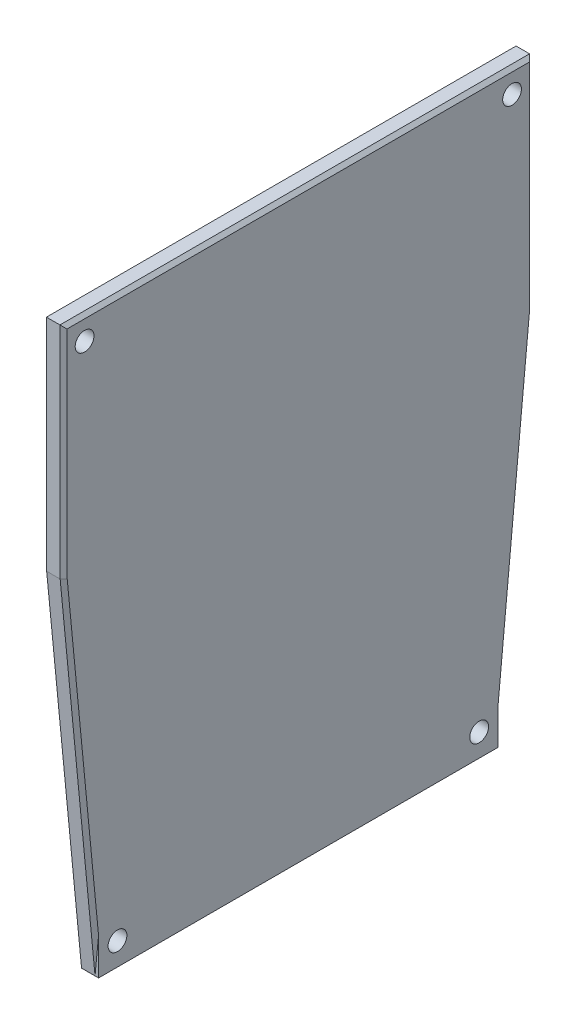
ISO-10303-21;
HEADER;
FILE_DESCRIPTION(('STEP AP214'),'2;1');
FILE_NAME('part.step','',(''),(''),'','','');
FILE_SCHEMA(('AUTOMOTIVE_DESIGN { 1 0 10303 214 1 1 1 1 }'));
ENDSEC;
DATA;
#1=APPLICATION_CONTEXT('core data for automotive mechanical design processes');
#2=APPLICATION_PROTOCOL_DEFINITION('international standard','automotive_design',2000,#1);
#3=PRODUCT_CONTEXT('',#1,'mechanical');
#4=PRODUCT('Part','Part','',(#3));
#5=PRODUCT_RELATED_PRODUCT_CATEGORY('part','',(#4));
#6=PRODUCT_DEFINITION_FORMATION('','',#4);
#7=PRODUCT_DEFINITION_CONTEXT('part definition',#1,'design');
#8=PRODUCT_DEFINITION('design','',#6,#7);
#9=PRODUCT_DEFINITION_SHAPE('','',#8);
#10=(LENGTH_UNIT() NAMED_UNIT(*) SI_UNIT(.MILLI.,.METRE.));
#11=(NAMED_UNIT(*) PLANE_ANGLE_UNIT() SI_UNIT($,.RADIAN.));
#12=(NAMED_UNIT(*) SI_UNIT($,.STERADIAN.) SOLID_ANGLE_UNIT());
#13=UNCERTAINTY_MEASURE_WITH_UNIT(LENGTH_MEASURE(1.E-05),#10,'distance_accuracy_value','');
#14=(GEOMETRIC_REPRESENTATION_CONTEXT(3) GLOBAL_UNCERTAINTY_ASSIGNED_CONTEXT((#13)) GLOBAL_UNIT_ASSIGNED_CONTEXT((#10,
#11,#12)) REPRESENTATION_CONTEXT('',''));
#15=CARTESIAN_POINT('',(0.,0.,0.));
#16=DIRECTION('',(0.,0.,1.));
#17=DIRECTION('',(1.,0.,0.));
#18=AXIS2_PLACEMENT_3D('',#15,#16,#17);
#19=CARTESIAN_POINT('',(31.6,-12.9798337295823,0.));
#20=DIRECTION('',(0.,-1.,0.));
#21=DIRECTION('',(0.,0.,-1.));
#22=AXIS2_PLACEMENT_3D('',#19,#20,#21);
#23=PLANE('',#22);
#24=DIRECTION('',(1.,0.,0.));
#25=VECTOR('',#24,1.);
#26=CARTESIAN_POINT('',(31.6,-12.9798337295823,42.209268938857));
#27=LINE('',#26,#25);
#28=CARTESIAN_POINT('',(30.15,-12.9798337295823,42.2092689388571));
#29=VERTEX_POINT('',#28);
#30=CARTESIAN_POINT('',(31.3,-12.9798337295823,42.209268938857));
#31=VERTEX_POINT('',#30);
#32=EDGE_CURVE('E175',#29,#31,#27,.T.);
#33=ORIENTED_EDGE('',*,*,#32,.T.);
#34=DIRECTION('',(0.,0.,-1.));
#35=VECTOR('',#34,1.);
#36=CARTESIAN_POINT('',(31.3,-12.9798337295823,2.5));
#37=LINE('',#36,#35);
#38=CARTESIAN_POINT('',(31.3,-12.9798337295823,2.2));
#39=VERTEX_POINT('',#38);
#40=EDGE_CURVE('E50',#31,#39,#37,.T.);
#41=ORIENTED_EDGE('',*,*,#40,.T.);
#42=DIRECTION('',(1.,0.,0.));
#43=VECTOR('',#42,1.);
#44=CARTESIAN_POINT('',(21.6,-12.9798337295823,2.2));
#45=LINE('',#44,#43);
#46=CARTESIAN_POINT('',(30.15,-12.9798337295823,2.2));
#47=VERTEX_POINT('',#46);
#48=EDGE_CURVE('E246',#47,#39,#45,.T.);
#49=ORIENTED_EDGE('',*,*,#48,.F.);
#50=DIRECTION('',(0.,0.,1.));
#51=VECTOR('',#50,1.);
#52=CARTESIAN_POINT('',(30.15,-12.9798337295823,0.));
#53=LINE('',#52,#51);
#54=EDGE_CURVE('E184',#47,#29,#53,.T.);
#55=ORIENTED_EDGE('',*,*,#54,.T.);
#56=EDGE_LOOP('',(#33,#41,#49,#55));
#57=FACE_BOUND('',#56,.T.);
#58=ADVANCED_FACE('F41',(#57),#23,.F.);
#59=CARTESIAN_POINT('',(31.6,-62.5097700608601,0.));
#60=DIRECTION('',(0.,1.,0.));
#61=DIRECTION('',(0.,0.,1.));
#62=AXIS2_PLACEMENT_3D('',#59,#60,#61);
#63=PLANE('',#62);
#64=DIRECTION('',(0.,0.,-1.));
#65=VECTOR('',#64,1.);
#66=CARTESIAN_POINT('',(31.6,-62.5097700608601,0.));
#67=LINE('',#66,#65);
#68=CARTESIAN_POINT('',(31.6,-62.5097700608601,39.2193923236684));
#69=VERTEX_POINT('',#68);
#70=CARTESIAN_POINT('',(31.6,-62.5097700608601,5.18060767633156));
#71=VERTEX_POINT('',#70);
#72=EDGE_CURVE('E151',#69,#71,#67,.T.);
#73=ORIENTED_EDGE('',*,*,#72,.F.);
#74=DIRECTION('',(1.,0.,0.));
#75=VECTOR('',#74,1.);
#76=CARTESIAN_POINT('',(21.6,-62.5097700608601,39.2193923236684));
#77=LINE('',#76,#75);
#78=CARTESIAN_POINT('',(30.15,-62.5097700608601,39.2193923236684));
#79=VERTEX_POINT('',#78);
#80=EDGE_CURVE('E134',#79,#69,#77,.T.);
#81=ORIENTED_EDGE('',*,*,#80,.F.);
#82=DIRECTION('',(0.,0.,-1.));
#83=VECTOR('',#82,1.);
#84=CARTESIAN_POINT('',(30.15,-62.5097700608601,0.));
#85=LINE('',#84,#83);
#86=CARTESIAN_POINT('',(30.15,-62.5097700608601,5.18060767633156));
#87=VERTEX_POINT('',#86);
#88=EDGE_CURVE('E187',#79,#87,#85,.T.);
#89=ORIENTED_EDGE('',*,*,#88,.T.);
#90=DIRECTION('',(1.,0.,0.));
#91=VECTOR('',#90,1.);
#92=CARTESIAN_POINT('',(31.6,-62.5097700608601,5.18060767633156));
#93=LINE('',#92,#91);
#94=EDGE_CURVE('E159',#87,#71,#93,.T.);
#95=ORIENTED_EDGE('',*,*,#94,.T.);
#96=EDGE_LOOP('',(#73,#81,#89,#95));
#97=FACE_BOUND('',#96,.T.);
#98=ADVANCED_FACE('F158',(#97),#63,.F.);
#99=CARTESIAN_POINT('',(31.6,-14.9298337295823,40.4092690105694));
#100=DIRECTION('',(-1.,0.,0.));
#101=DIRECTION('',(0.,0.,1.));
#102=AXIS2_PLACEMENT_3D('',#99,#100,#101);
#103=CYLINDRICAL_SURFACE('',#102,0.800000000000002);
#104=CARTESIAN_POINT('',(31.6,-14.9298337295823,40.4092690105694));
#105=DIRECTION('',(1.,0.,0.));
#106=DIRECTION('',(0.,0.,-1.));
#107=AXIS2_PLACEMENT_3D('',#104,#105,#106);
#108=CIRCLE('',#107,0.800000000000002);
#109=CARTESIAN_POINT('',(31.6,-14.9298337295823,39.6092690105694));
#110=VERTEX_POINT('',#109);
#111=EDGE_CURVE('E161',#110,#110,#108,.T.);
#112=ORIENTED_EDGE('',*,*,#111,.T.);
#113=EDGE_LOOP('',(#112));
#114=FACE_BOUND('',#113,.T.);
#115=CARTESIAN_POINT('',(30.15,-14.9298337295823,40.4092690105694));
#116=DIRECTION('',(1.,0.,0.));
#117=DIRECTION('',(0.,0.,-1.));
#118=AXIS2_PLACEMENT_3D('',#115,#116,#117);
#119=CIRCLE('',#118,0.800000000000002);
#120=CARTESIAN_POINT('',(30.15,-14.9298337295823,39.6092690105694));
#121=VERTEX_POINT('',#120);
#122=EDGE_CURVE('E181',#121,#121,#119,.T.);
#123=ORIENTED_EDGE('',*,*,#122,.F.);
#124=EDGE_LOOP('',(#123));
#125=FACE_BOUND('',#124,.T.);
#126=ADVANCED_FACE('F300',(#114,#125),#103,.F.);
#127=CARTESIAN_POINT('',(31.6,-14.9298337295823,3.9907309894306));
#128=DIRECTION('',(-1.,0.,0.));
#129=DIRECTION('',(0.,0.,1.));
#130=AXIS2_PLACEMENT_3D('',#127,#128,#129);
#131=CYLINDRICAL_SURFACE('',#130,0.8);
#132=CARTESIAN_POINT('',(31.6,-14.9298337295823,3.9907309894306));
#133=DIRECTION('',(1.,0.,0.));
#134=DIRECTION('',(0.,0.,-1.));
#135=AXIS2_PLACEMENT_3D('',#132,#133,#134);
#136=CIRCLE('',#135,0.8);
#137=CARTESIAN_POINT('',(31.6,-14.9298337295823,3.1907309894306));
#138=VERTEX_POINT('',#137);
#139=EDGE_CURVE('E167',#138,#138,#136,.T.);
#140=ORIENTED_EDGE('',*,*,#139,.T.);
#141=EDGE_LOOP('',(#140));
#142=FACE_BOUND('',#141,.T.);
#143=CARTESIAN_POINT('',(30.15,-14.9298337295823,3.9907309894306));
#144=DIRECTION('',(1.,0.,0.));
#145=DIRECTION('',(0.,0.,-1.));
#146=AXIS2_PLACEMENT_3D('',#143,#144,#145);
#147=CIRCLE('',#146,0.8);
#148=CARTESIAN_POINT('',(30.15,-14.9298337295823,3.1907309894306));
#149=VERTEX_POINT('',#148);
#150=EDGE_CURVE('E178',#149,#149,#147,.T.);
#151=ORIENTED_EDGE('',*,*,#150,.F.);
#152=EDGE_LOOP('',(#151));
#153=FACE_BOUND('',#152,.T.);
#154=ADVANCED_FACE('F290',(#142,#153),#131,.F.);
#155=CARTESIAN_POINT('',(31.6,-60.5690390714295,6.79357246262316));
#156=DIRECTION('',(-1.,0.,0.));
#157=DIRECTION('',(0.,0.,1.));
#158=AXIS2_PLACEMENT_3D('',#155,#156,#157);
#159=CYLINDRICAL_SURFACE('',#158,0.800000000000002);
#160=CARTESIAN_POINT('',(31.6,-60.5690390714295,6.79357246262316));
#161=DIRECTION('',(1.,0.,0.));
#162=DIRECTION('',(0.,0.,-1.));
#163=AXIS2_PLACEMENT_3D('',#160,#161,#162);
#164=CIRCLE('',#163,0.800000000000002);
#165=CARTESIAN_POINT('',(31.6,-60.5690390714295,5.99357246262315));
#166=VERTEX_POINT('',#165);
#167=EDGE_CURVE('E285',#166,#166,#164,.T.);
#168=ORIENTED_EDGE('',*,*,#167,.T.);
#169=EDGE_LOOP('',(#168));
#170=FACE_BOUND('',#169,.T.);
#171=CARTESIAN_POINT('',(30.15,-60.5690390714295,6.79357246262316));
#172=DIRECTION('',(1.,0.,0.));
#173=DIRECTION('',(0.,0.,-1.));
#174=AXIS2_PLACEMENT_3D('',#171,#172,#173);
#175=CIRCLE('',#174,0.800000000000002);
#176=CARTESIAN_POINT('',(30.15,-60.5690390714295,5.99357246262315));
#177=VERTEX_POINT('',#176);
#178=EDGE_CURVE('E174',#177,#177,#175,.T.);
#179=ORIENTED_EDGE('',*,*,#178,.F.);
#180=EDGE_LOOP('',(#179));
#181=FACE_BOUND('',#180,.T.);
#182=ADVANCED_FACE('F348',(#170,#181),#159,.F.);
#183=CARTESIAN_POINT('',(31.6,-60.5690390714295,37.6064275373769));
#184=DIRECTION('',(-1.,0.,0.));
#185=DIRECTION('',(0.,0.,1.));
#186=AXIS2_PLACEMENT_3D('',#183,#184,#185);
#187=CYLINDRICAL_SURFACE('',#186,0.800000000000003);
#188=CARTESIAN_POINT('',(31.6,-60.5690390714295,37.6064275373769));
#189=DIRECTION('',(1.,0.,0.));
#190=DIRECTION('',(0.,0.,-1.));
#191=AXIS2_PLACEMENT_3D('',#188,#189,#190);
#192=CIRCLE('',#191,0.800000000000003);
#193=CARTESIAN_POINT('',(31.6,-60.5690390714295,36.8064275373768));
#194=VERTEX_POINT('',#193);
#195=EDGE_CURVE('E188',#194,#194,#192,.T.);
#196=ORIENTED_EDGE('',*,*,#195,.T.);
#197=EDGE_LOOP('',(#196));
#198=FACE_BOUND('',#197,.T.);
#199=CARTESIAN_POINT('',(30.15,-60.5690390714295,37.6064275373769));
#200=DIRECTION('',(1.,0.,0.));
#201=DIRECTION('',(0.,0.,-1.));
#202=AXIS2_PLACEMENT_3D('',#199,#200,#201);
#203=CIRCLE('',#202,0.800000000000003);
#204=CARTESIAN_POINT('',(30.15,-60.5690390714295,36.8064275373768));
#205=VERTEX_POINT('',#204);
#206=EDGE_CURVE('E171',#205,#205,#203,.T.);
#207=ORIENTED_EDGE('',*,*,#206,.F.);
#208=EDGE_LOOP('',(#207));
#209=FACE_BOUND('',#208,.T.);
#210=ADVANCED_FACE('F296',(#198,#209),#187,.F.);
#211=CARTESIAN_POINT('',(31.6,0.,0.));
#212=DIRECTION('',(1.,0.,0.));
#213=DIRECTION('',(0.,0.,-1.));
#214=AXIS2_PLACEMENT_3D('',#211,#212,#213);
#215=PLANE('',#214);
#216=DIRECTION('',(0.,1.,0.));
#217=VECTOR('',#216,1.);
#218=CARTESIAN_POINT('',(31.6,-12.9798337295823,2.5));
#219=LINE('',#218,#217);
#220=CARTESIAN_POINT('',(31.6,-31.0470612247422,2.5));
#221=VERTEX_POINT('',#220);
#222=CARTESIAN_POINT('',(31.6,-13.2798337295823,2.5));
#223=VERTEX_POINT('',#222);
#224=EDGE_CURVE('E212',#221,#223,#219,.T.);
#225=ORIENTED_EDGE('',*,*,#224,.T.);
#226=DIRECTION('',(0.,0.,1.));
#227=VECTOR('',#226,1.);
#228=CARTESIAN_POINT('',(31.6,-13.2798337295823,41.9092687954324));
#229=LINE('',#228,#227);
#230=CARTESIAN_POINT('',(31.6,-13.2798337295823,41.9089754444646));
#231=VERTEX_POINT('',#230);
#232=EDGE_CURVE('E238',#223,#231,#229,.T.);
#233=ORIENTED_EDGE('',*,*,#232,.T.);
#234=DIRECTION('',(0.,-0.999999521918175,-0.000977836091834958));
#235=VECTOR('',#234,1.);
#236=CARTESIAN_POINT('',(31.6,-31.7375962208836,41.8909267694974));
#237=LINE('',#236,#235);
#238=CARTESIAN_POINT('',(31.6,-31.7232851239901,41.8909407634111));
#239=VERTEX_POINT('',#238);
#240=EDGE_CURVE('E232',#231,#239,#237,.T.);
#241=ORIENTED_EDGE('',*,*,#240,.T.);
#242=DIRECTION('',(0.,-0.995365494715316,-0.0961640885681093));
#243=VECTOR('',#242,1.);
#244=CARTESIAN_POINT('',(31.6,-62.4664962210045,38.9207826752538));
#245=LINE('',#244,#243);
#246=CARTESIAN_POINT('',(31.6,-59.3756777580347,39.2193923236684));
#247=VERTEX_POINT('',#246);
#248=EDGE_CURVE('E153',#239,#247,#245,.T.);
#249=ORIENTED_EDGE('',*,*,#248,.T.);
#250=DIRECTION('',(0.,1.,0.));
#251=VECTOR('',#250,1.);
#252=CARTESIAN_POINT('',(31.6,-62.5097700608601,39.2193923236684));
#253=LINE('',#252,#251);
#254=EDGE_CURVE('E137',#69,#247,#253,.T.);
#255=ORIENTED_EDGE('',*,*,#254,.F.);
#256=ORIENTED_EDGE('',*,*,#72,.T.);
#257=DIRECTION('',(0.,-1.,0.));
#258=VECTOR('',#257,1.);
#259=CARTESIAN_POINT('',(31.6,-62.4953454475749,5.18060767633156));
#260=LINE('',#259,#258);
#261=CARTESIAN_POINT('',(31.6,-59.3756777580348,5.18060767633156));
#262=VERTEX_POINT('',#261);
#263=EDGE_CURVE('E228',#262,#71,#260,.T.);
#264=ORIENTED_EDGE('',*,*,#263,.F.);
#265=DIRECTION('',(0.,0.995365494715316,-0.0961640885681094));
#266=VECTOR('',#265,1.);
#267=CARTESIAN_POINT('',(31.6,-31.7081365017841,2.50759570037504));
#268=LINE('',#267,#266);
#269=CARTESIAN_POINT('',(31.6,-31.7205735939202,2.50879727068873));
#270=VERTEX_POINT('',#269);
#271=EDGE_CURVE('E208',#262,#270,#268,.T.);
#272=ORIENTED_EDGE('',*,*,#271,.T.);
#273=DIRECTION('',(0.,0.999914705859767,-0.0130606663450287));
#274=VECTOR('',#273,1.);
#275=CARTESIAN_POINT('',(31.6,-31.0451022083439,2.49997441175793));
#276=LINE('',#275,#274);
#277=EDGE_CURVE('E210',#270,#221,#276,.T.);
#278=ORIENTED_EDGE('',*,*,#277,.T.);
#279=EDGE_LOOP('',(#225,#233,#241,#249,#255,#256,#264,#272,#278));
#280=FACE_BOUND('',#279,.T.);
#281=ORIENTED_EDGE('',*,*,#195,.F.);
#282=EDGE_LOOP('',(#281));
#283=FACE_BOUND('',#282,.T.);
#284=ORIENTED_EDGE('',*,*,#167,.F.);
#285=EDGE_LOOP('',(#284));
#286=FACE_BOUND('',#285,.T.);
#287=ORIENTED_EDGE('',*,*,#139,.F.);
#288=EDGE_LOOP('',(#287));
#289=FACE_BOUND('',#288,.T.);
#290=ORIENTED_EDGE('',*,*,#111,.F.);
#291=EDGE_LOOP('',(#290));
#292=FACE_BOUND('',#291,.T.);
#293=ADVANCED_FACE('F149',(#280,#283,#286,#289,#292),#215,.T.);
#294=CARTESIAN_POINT('',(30.15,0.,0.));
#295=DIRECTION('',(1.,0.,0.));
#296=DIRECTION('',(0.,0.,-1.));
#297=AXIS2_PLACEMENT_3D('',#294,#295,#296);
#298=PLANE('',#297);
#299=ORIENTED_EDGE('',*,*,#206,.T.);
#300=EDGE_LOOP('',(#299));
#301=FACE_BOUND('',#300,.T.);
#302=ORIENTED_EDGE('',*,*,#178,.T.);
#303=EDGE_LOOP('',(#302));
#304=FACE_BOUND('',#303,.T.);
#305=ORIENTED_EDGE('',*,*,#150,.T.);
#306=EDGE_LOOP('',(#305));
#307=FACE_BOUND('',#306,.T.);
#308=ORIENTED_EDGE('',*,*,#122,.T.);
#309=EDGE_LOOP('',(#308));
#310=FACE_BOUND('',#309,.T.);
#311=DIRECTION('',(0.,0.995365494715316,0.0961640885681093));
#312=VECTOR('',#311,1.);
#313=CARTESIAN_POINT('',(30.15,-4.33194579619204,44.8386651889566));
#314=LINE('',#313,#312);
#315=CARTESIAN_POINT('',(30.15,-62.4953454475749,39.2193923236684));
#316=VERTEX_POINT('',#315);
#317=CARTESIAN_POINT('',(30.15,-31.7378895717112,42.1909266260728));
#318=VERTEX_POINT('',#317);
#319=EDGE_CURVE('E199',#316,#318,#314,.T.);
#320=ORIENTED_EDGE('',*,*,#319,.T.);
#321=DIRECTION('',(0.,0.999999521918175,0.000977836091834958));
#322=VECTOR('',#321,1.);
#323=CARTESIAN_POINT('',(30.15,-0.0412861376883969,42.2219207237169));
#324=LINE('',#323,#322);
#325=EDGE_CURVE('E202',#318,#29,#324,.T.);
#326=ORIENTED_EDGE('',*,*,#325,.T.);
#327=ORIENTED_EDGE('',*,*,#54,.F.);
#328=DIRECTION('',(0.,-1.,0.));
#329=VECTOR('',#328,1.);
#330=CARTESIAN_POINT('',(30.15,0.,2.2));
#331=LINE('',#330,#329);
#332=CARTESIAN_POINT('',(30.15,-31.0490204082474,2.2));
#333=VERTEX_POINT('',#332);
#334=EDGE_CURVE('E160',#47,#333,#331,.T.);
#335=ORIENTED_EDGE('',*,*,#334,.T.);
#336=DIRECTION('',(0.,-0.999914705859767,0.0130606663450287));
#337=VECTOR('',#336,1.);
#338=CARTESIAN_POINT('',(30.15,0.0234346420456044,1.79413841445223));
#339=LINE('',#338,#337);
#340=CARTESIAN_POINT('',(30.15,-31.7369857283545,2.20898605196045));
#341=VERTEX_POINT('',#340);
#342=EDGE_CURVE('E164',#333,#341,#339,.T.);
#343=ORIENTED_EDGE('',*,*,#342,.T.);
#344=DIRECTION('',(0.,-0.995365494715316,0.0961640885681094));
#345=VECTOR('',#344,1.);
#346=CARTESIAN_POINT('',(30.15,-0.0820481439319504,-0.849255606654629));
#347=LINE('',#346,#345);
#348=CARTESIAN_POINT('',(30.15,-62.4953454475749,5.18060767633156));
#349=VERTEX_POINT('',#348);
#350=EDGE_CURVE('E192',#341,#349,#347,.T.);
#351=ORIENTED_EDGE('',*,*,#350,.T.);
#352=DIRECTION('',(0.,-1.,0.));
#353=VECTOR('',#352,1.);
#354=CARTESIAN_POINT('',(30.15,0.,5.18060767633156));
#355=LINE('',#354,#353);
#356=EDGE_CURVE('E195',#349,#87,#355,.T.);
#357=ORIENTED_EDGE('',*,*,#356,.T.);
#358=ORIENTED_EDGE('',*,*,#88,.F.);
#359=DIRECTION('',(0.,1.,0.));
#360=VECTOR('',#359,1.);
#361=CARTESIAN_POINT('',(30.15,0.,39.2193923236684));
#362=LINE('',#361,#360);
#363=EDGE_CURVE('E140',#79,#316,#362,.T.);
#364=ORIENTED_EDGE('',*,*,#363,.T.);
#365=EDGE_LOOP('',(#320,#326,#327,#335,#343,#351,#357,#358,#364));
#366=FACE_BOUND('',#365,.T.);
#367=ADVANCED_FACE('F295',(#301,#304,#307,#310,#366),#298,.F.);
#368=CARTESIAN_POINT('',(21.6,-62.4953454475749,5.18060767633156));
#369=DIRECTION('',(0.,0.,1.));
#370=DIRECTION('',(1.,0.,0.));
#371=AXIS2_PLACEMENT_3D('',#368,#369,#370);
#372=PLANE('',#371);
#373=ORIENTED_EDGE('',*,*,#356,.F.);
#374=DIRECTION('',(1.,0.,0.));
#375=VECTOR('',#374,1.);
#376=CARTESIAN_POINT('',(21.6,-62.4953454475749,5.18060767633156));
#377=LINE('',#376,#375);
#378=CARTESIAN_POINT('',(31.3,-62.4953454475749,5.18060767633156));
#379=VERTEX_POINT('',#378);
#380=EDGE_CURVE('E155',#349,#379,#377,.T.);
#381=ORIENTED_EDGE('',*,*,#380,.T.);
#382=DIRECTION('',(0.0957225086225032,0.995408057704485,0.));
#383=VECTOR('',#382,1.);
#384=CARTESIAN_POINT('',(31.2111208530272,-63.4195901245242,5.18060767633156));
#385=LINE('',#384,#383);
#386=EDGE_CURVE('E218',#379,#262,#385,.T.);
#387=ORIENTED_EDGE('',*,*,#386,.T.);
#388=ORIENTED_EDGE('',*,*,#263,.T.);
#389=ORIENTED_EDGE('',*,*,#94,.F.);
#390=EDGE_LOOP('',(#373,#381,#387,#388,#389));
#391=FACE_BOUND('',#390,.T.);
#392=ADVANCED_FACE('F308',(#391),#372,.F.);
#393=CARTESIAN_POINT('',(21.6,-31.7369857283545,2.20898605196045));
#394=DIRECTION('',(0.,0.0961640885681094,0.995365494715316));
#395=DIRECTION('',(0.,-0.995365494715316,0.0961640885681094));
#396=AXIS2_PLACEMENT_3D('',#393,#394,#395);
#397=PLANE('',#396);
#398=DIRECTION('',(1.,0.,0.));
#399=VECTOR('',#398,1.);
#400=CARTESIAN_POINT('',(21.6,-31.7369857283545,2.20898605196045));
#401=LINE('',#400,#399);
#402=CARTESIAN_POINT('',(31.3,-31.7369857283545,2.20898605196045));
#403=VERTEX_POINT('',#402);
#404=EDGE_CURVE('E277',#341,#403,#401,.T.);
#405=ORIENTED_EDGE('',*,*,#404,.T.);
#406=DIRECTION('',(0.,-0.995365494715316,0.0961640885681094));
#407=VECTOR('',#406,1.);
#408=CARTESIAN_POINT('',(31.3,-62.4953454475749,5.18060767633156));
#409=LINE('',#408,#407);
#410=EDGE_CURVE('E216',#403,#379,#409,.T.);
#411=ORIENTED_EDGE('',*,*,#410,.T.);
#412=ORIENTED_EDGE('',*,*,#380,.F.);
#413=ORIENTED_EDGE('',*,*,#350,.F.);
#414=EDGE_LOOP('',(#405,#411,#412,#413));
#415=FACE_BOUND('',#414,.T.);
#416=ADVANCED_FACE('F315',(#415),#397,.F.);
#417=CARTESIAN_POINT('',(21.6,-31.0490204082474,2.2));
#418=DIRECTION('',(0.,0.0130606663450287,0.999914705859767));
#419=DIRECTION('',(0.,-0.999914705859767,0.0130606663450287));
#420=AXIS2_PLACEMENT_3D('',#417,#418,#419);
#421=PLANE('',#420);
#422=DIRECTION('',(1.,0.,0.));
#423=VECTOR('',#422,1.);
#424=CARTESIAN_POINT('',(21.6,-31.0490204082474,2.2));
#425=LINE('',#424,#423);
#426=CARTESIAN_POINT('',(31.3,-31.0490204082474,2.2));
#427=VERTEX_POINT('',#426);
#428=EDGE_CURVE('E251',#333,#427,#425,.T.);
#429=ORIENTED_EDGE('',*,*,#428,.T.);
#430=DIRECTION('',(0.,-0.999914705859767,0.0130606663450287));
#431=VECTOR('',#430,1.);
#432=CARTESIAN_POINT('',(31.3,-31.7369857283545,2.20898605196045));
#433=LINE('',#432,#431);
#434=EDGE_CURVE('E214',#427,#403,#433,.T.);
#435=ORIENTED_EDGE('',*,*,#434,.T.);
#436=ORIENTED_EDGE('',*,*,#404,.F.);
#437=ORIENTED_EDGE('',*,*,#342,.F.);
#438=EDGE_LOOP('',(#429,#435,#436,#437));
#439=FACE_BOUND('',#438,.T.);
#440=ADVANCED_FACE('F326',(#439),#421,.F.);
#441=CARTESIAN_POINT('',(21.6,-31.0490204082474,2.2));
#442=DIRECTION('',(0.,0.,1.));
#443=DIRECTION('',(1.,0.,0.));
#444=AXIS2_PLACEMENT_3D('',#441,#442,#443);
#445=PLANE('',#444);
#446=ORIENTED_EDGE('',*,*,#48,.T.);
#447=DIRECTION('',(0.,-1.,0.));
#448=VECTOR('',#447,1.);
#449=CARTESIAN_POINT('',(31.3,-31.0490204082474,2.2));
#450=LINE('',#449,#448);
#451=EDGE_CURVE('E205',#39,#427,#450,.T.);
#452=ORIENTED_EDGE('',*,*,#451,.T.);
#453=ORIENTED_EDGE('',*,*,#428,.F.);
#454=ORIENTED_EDGE('',*,*,#334,.F.);
#455=EDGE_LOOP('',(#446,#452,#453,#454));
#456=FACE_BOUND('',#455,.T.);
#457=ADVANCED_FACE('F249',(#456),#445,.F.);
#458=CARTESIAN_POINT('',(21.6,-12.9796870541685,42.2092690822816));
#459=DIRECTION('',(0.,0.000977836091834958,-0.999999521918175));
#460=DIRECTION('',(0.,0.999999521918175,0.000977836091834958));
#461=AXIS2_PLACEMENT_3D('',#458,#459,#460);
#462=PLANE('',#461);
#463=DIRECTION('',(1.,0.,0.));
#464=VECTOR('',#463,1.);
#465=CARTESIAN_POINT('',(21.6,-31.7378895717112,42.1909266260728));
#466=LINE('',#465,#464);
#467=CARTESIAN_POINT('',(31.3,-31.7378895717112,42.1909266260728));
#468=VERTEX_POINT('',#467);
#469=EDGE_CURVE('E270',#318,#468,#466,.T.);
#470=ORIENTED_EDGE('',*,*,#469,.T.);
#471=DIRECTION('',(0.,0.999999521918175,0.000977836091834958));
#472=VECTOR('',#471,1.);
#473=CARTESIAN_POINT('',(31.3,-12.9798337295823,42.2092689388571));
#474=LINE('',#473,#472);
#475=EDGE_CURVE('E221',#468,#31,#474,.T.);
#476=ORIENTED_EDGE('',*,*,#475,.T.);
#477=ORIENTED_EDGE('',*,*,#32,.F.);
#478=ORIENTED_EDGE('',*,*,#325,.F.);
#479=EDGE_LOOP('',(#470,#476,#477,#478));
#480=FACE_BOUND('',#479,.T.);
#481=ADVANCED_FACE('F335',(#480),#462,.F.);
#482=CARTESIAN_POINT('',(21.6,-31.7378895717112,42.1909266260728));
#483=DIRECTION('',(0.,0.0961640885681093,-0.995365494715316));
#484=DIRECTION('',(0.,0.995365494715316,0.0961640885681093));
#485=AXIS2_PLACEMENT_3D('',#482,#483,#484);
#486=PLANE('',#485);
#487=DIRECTION('',(1.,0.,0.));
#488=VECTOR('',#487,1.);
#489=CARTESIAN_POINT('',(21.6,-62.4953454475749,39.2193923236684));
#490=LINE('',#489,#488);
#491=CARTESIAN_POINT('',(31.3,-62.4953454475749,39.2193923236684));
#492=VERTEX_POINT('',#491);
#493=EDGE_CURVE('E145',#316,#492,#490,.T.);
#494=ORIENTED_EDGE('',*,*,#493,.T.);
#495=DIRECTION('',(0.,0.995365494715316,0.0961640885681093));
#496=VECTOR('',#495,1.);
#497=CARTESIAN_POINT('',(31.3,-31.7378895717111,42.1909266260728));
#498=LINE('',#497,#496);
#499=EDGE_CURVE('E234',#492,#468,#498,.T.);
#500=ORIENTED_EDGE('',*,*,#499,.T.);
#501=ORIENTED_EDGE('',*,*,#469,.F.);
#502=ORIENTED_EDGE('',*,*,#319,.F.);
#503=EDGE_LOOP('',(#494,#500,#501,#502));
#504=FACE_BOUND('',#503,.T.);
#505=ADVANCED_FACE('F267',(#504),#486,.F.);
#506=CARTESIAN_POINT('',(21.6,-62.5097700608601,39.2193923236684));
#507=DIRECTION('',(0.,0.,-1.));
#508=DIRECTION('',(-1.,0.,0.));
#509=AXIS2_PLACEMENT_3D('',#506,#507,#508);
#510=PLANE('',#509);
#511=ORIENTED_EDGE('',*,*,#80,.T.);
#512=ORIENTED_EDGE('',*,*,#254,.T.);
#513=DIRECTION('',(-0.0957225086225032,-0.995408057704485,0.));
#514=VECTOR('',#513,1.);
#515=CARTESIAN_POINT('',(31.2097464332287,-63.4338825679822,39.2193923236684));
#516=LINE('',#515,#514);
#517=EDGE_CURVE('E236',#247,#492,#516,.T.);
#518=ORIENTED_EDGE('',*,*,#517,.T.);
#519=ORIENTED_EDGE('',*,*,#493,.F.);
#520=ORIENTED_EDGE('',*,*,#363,.F.);
#521=EDGE_LOOP('',(#511,#512,#518,#519,#520));
#522=FACE_BOUND('',#521,.T.);
#523=ADVANCED_FACE('F136',(#522),#510,.F.);
#524=CARTESIAN_POINT('',(31.3,-31.7369857283545,2.20898605196045));
#525=DIRECTION('',(0.70710678118655,-0.0679982791331337,-0.7038296910723));
#526=DIRECTION('',(0.,0.995365494715316,-0.0961640885681094));
#527=AXIS2_PLACEMENT_3D('',#524,#525,#526);
#528=PLANE('',#527);
#529=ORIENTED_EDGE('',*,*,#386,.F.);
#530=ORIENTED_EDGE('',*,*,#410,.F.);
#531=DIRECTION('',(0.706800322005664,0.0386670063430628,0.706355553126862));
#532=VECTOR('',#531,1.);
#533=CARTESIAN_POINT('',(31.3,-31.7369857283545,2.20898605196045));
#534=LINE('',#533,#532);
#535=EDGE_CURVE('E224',#270,#403,#534,.F.);
#536=ORIENTED_EDGE('',*,*,#535,.F.);
#537=ORIENTED_EDGE('',*,*,#271,.F.);
#538=EDGE_LOOP('',(#529,#530,#536,#537));
#539=FACE_BOUND('',#538,.T.);
#540=ADVANCED_FACE('F320',(#539),#528,.T.);
#541=CARTESIAN_POINT('',(31.3,-31.0490204082474,2.2));
#542=DIRECTION('',(0.707106781186549,-0.00923528573938472,-0.707046469121591));
#543=DIRECTION('',(0.,0.999914705859767,-0.0130606663450287));
#544=AXIS2_PLACEMENT_3D('',#541,#542,#543);
#545=PLANE('',#544);
#546=ORIENTED_EDGE('',*,*,#535,.T.);
#547=ORIENTED_EDGE('',*,*,#434,.F.);
#548=DIRECTION('',(0.707099241977473,0.00461779057135463,0.707099241977477));
#549=VECTOR('',#548,1.);
#550=CARTESIAN_POINT('',(31.3,-31.0490204082474,2.2));
#551=LINE('',#550,#549);
#552=EDGE_CURVE('E222',#221,#427,#551,.F.);
#553=ORIENTED_EDGE('',*,*,#552,.F.);
#554=ORIENTED_EDGE('',*,*,#277,.F.);
#555=EDGE_LOOP('',(#546,#547,#553,#554));
#556=FACE_BOUND('',#555,.T.);
#557=ADVANCED_FACE('F324',(#556),#545,.T.);
#558=CARTESIAN_POINT('',(31.3,-31.0490204082474,2.2));
#559=DIRECTION('',(0.70710678118655,0.,-0.707106781186545));
#560=DIRECTION('',(0.,1.,0.));
#561=AXIS2_PLACEMENT_3D('',#558,#559,#560);
#562=PLANE('',#561);
#563=ORIENTED_EDGE('',*,*,#451,.F.);
#564=DIRECTION('',(0.577350269189625,-0.577350269189625,0.577350269189628));
#565=VECTOR('',#564,1.);
#566=CARTESIAN_POINT('',(37.3230622262217,-19.002895955804,8.2230622262217));
#567=LINE('',#566,#565);
#568=EDGE_CURVE('E11',#39,#223,#567,.T.);
#569=ORIENTED_EDGE('',*,*,#568,.T.);
#570=ORIENTED_EDGE('',*,*,#224,.F.);
#571=ORIENTED_EDGE('',*,*,#552,.T.);
#572=EDGE_LOOP('',(#563,#569,#570,#571));
#573=FACE_BOUND('',#572,.T.);
#574=ADVANCED_FACE('F253',(#573),#562,.T.);
#575=CARTESIAN_POINT('',(31.3,-31.7378895717112,42.1909266260728));
#576=DIRECTION('',(0.70710678118655,-0.0679982791331337,0.7038296910723));
#577=DIRECTION('',(0.,-0.995365494715316,-0.0961640885681093));
#578=AXIS2_PLACEMENT_3D('',#575,#576,#577);
#579=PLANE('',#578);
#580=ORIENTED_EDGE('',*,*,#517,.F.);
#581=ORIENTED_EDGE('',*,*,#248,.F.);
#582=DIRECTION('',(-0.706704843857534,-0.0344034464875175,0.706671540772712));
#583=VECTOR('',#582,1.);
#584=CARTESIAN_POINT('',(31.3,-31.7378895717112,42.1909266260728));
#585=LINE('',#584,#583);
#586=EDGE_CURVE('E225',#468,#239,#585,.F.);
#587=ORIENTED_EDGE('',*,*,#586,.F.);
#588=ORIENTED_EDGE('',*,*,#499,.F.);
#589=EDGE_LOOP('',(#580,#581,#587,#588));
#590=FACE_BOUND('',#589,.T.);
#591=ADVANCED_FACE('F263',(#590),#579,.T.);
#592=CARTESIAN_POINT('',(31.3,-12.9796870541685,42.2092690822816));
#593=DIRECTION('',(0.707106781186556,-0.000691434531425443,0.707106443131639));
#594=DIRECTION('',(0.,-0.999999521918175,-0.000977836091834958));
#595=AXIS2_PLACEMENT_3D('',#592,#593,#594);
#596=PLANE('',#595);
#597=ORIENTED_EDGE('',*,*,#240,.F.);
#598=DIRECTION('',(-0.577161992489126,0.577161992489126,0.577726638516837));
#599=VECTOR('',#598,1.);
#600=CARTESIAN_POINT('',(31.2999510922542,-12.9797848218365,42.2093178944501));
#601=LINE('',#600,#599);
#602=EDGE_CURVE('E63',#231,#31,#601,.T.);
#603=ORIENTED_EDGE('',*,*,#602,.T.);
#604=ORIENTED_EDGE('',*,*,#475,.F.);
#605=ORIENTED_EDGE('',*,*,#586,.T.);
#606=EDGE_LOOP('',(#597,#603,#604,#605));
#607=FACE_BOUND('',#606,.T.);
#608=ADVANCED_FACE('F258',(#607),#596,.T.);
#609=CARTESIAN_POINT('',(31.6,-13.2798337295823,0.));
#610=DIRECTION('',(0.707106781186548,0.707106781186548,0.));
#611=DIRECTION('',(0.,0.,-1.));
#612=AXIS2_PLACEMENT_3D('',#609,#610,#611);
#613=PLANE('',#612);
#614=ORIENTED_EDGE('',*,*,#568,.F.);
#615=ORIENTED_EDGE('',*,*,#40,.F.);
#616=ORIENTED_EDGE('',*,*,#602,.F.);
#617=ORIENTED_EDGE('',*,*,#232,.F.);
#618=EDGE_LOOP('',(#614,#615,#616,#617));
#619=FACE_BOUND('',#618,.T.);
#620=ADVANCED_FACE('F44',(#619),#613,.T.);
#621=CLOSED_SHELL('',(#58,#98,#126,#154,#182,#210,#293,#367,#392,#416,#440,#457,#481,#505,#523,
#540,#557,#574,#591,#608,#620));
#622=MANIFOLD_SOLID_BREP('B2',#621);
#623=ADVANCED_BREP_SHAPE_REPRESENTATION('',(#18,#622),#14);
#624=SHAPE_DEFINITION_REPRESENTATION(#9,#623);
ENDSEC;
END-ISO-10303-21;
